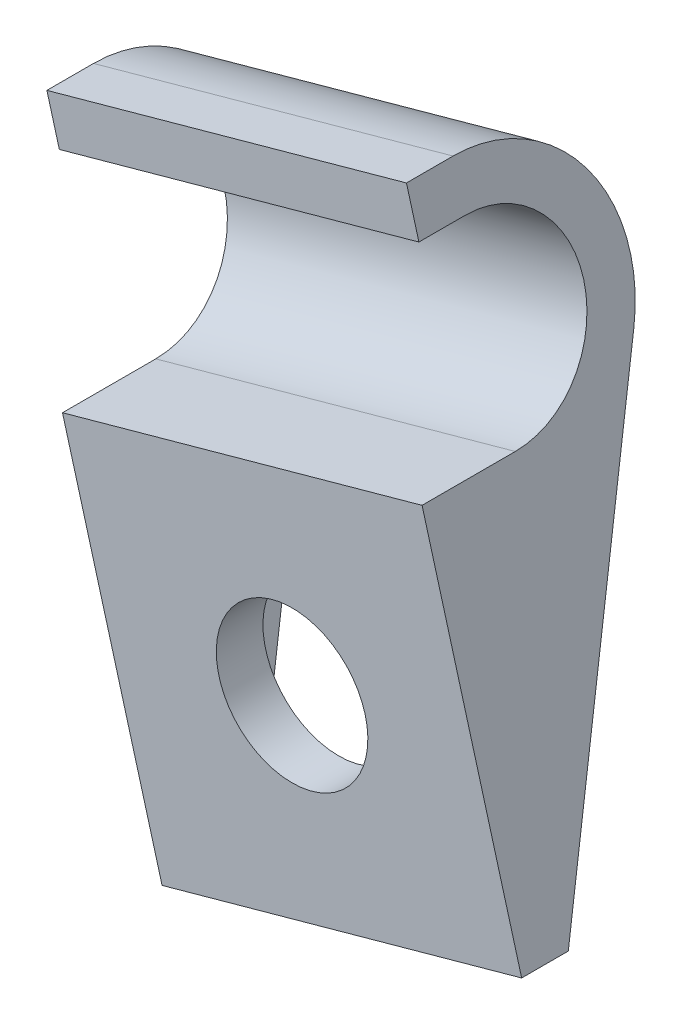
ISO-10303-21;
HEADER;
FILE_DESCRIPTION(('STEP AP214'),'2;1');
FILE_NAME('part.step','',(''),(''),'','','');
FILE_SCHEMA(('AUTOMOTIVE_DESIGN { 1 0 10303 214 1 1 1 1 }'));
ENDSEC;
DATA;
#1=APPLICATION_CONTEXT('core data for automotive mechanical design processes');
#2=APPLICATION_PROTOCOL_DEFINITION('international standard','automotive_design',2000,#1);
#3=PRODUCT_CONTEXT('',#1,'mechanical');
#4=PRODUCT('Part','Part','',(#3));
#5=PRODUCT_RELATED_PRODUCT_CATEGORY('part','',(#4));
#6=PRODUCT_DEFINITION_FORMATION('','',#4);
#7=PRODUCT_DEFINITION_CONTEXT('part definition',#1,'design');
#8=PRODUCT_DEFINITION('design','',#6,#7);
#9=PRODUCT_DEFINITION_SHAPE('','',#8);
#10=(LENGTH_UNIT() NAMED_UNIT(*) SI_UNIT(.MILLI.,.METRE.));
#11=(NAMED_UNIT(*) PLANE_ANGLE_UNIT() SI_UNIT($,.RADIAN.));
#12=(NAMED_UNIT(*) SI_UNIT($,.STERADIAN.) SOLID_ANGLE_UNIT());
#13=UNCERTAINTY_MEASURE_WITH_UNIT(LENGTH_MEASURE(1.E-05),#10,'distance_accuracy_value','');
#14=(GEOMETRIC_REPRESENTATION_CONTEXT(3) GLOBAL_UNCERTAINTY_ASSIGNED_CONTEXT((#13)) GLOBAL_UNIT_ASSIGNED_CONTEXT((#10,
#11,#12)) REPRESENTATION_CONTEXT('',''));
#15=CARTESIAN_POINT('',(0.,0.,0.));
#16=DIRECTION('',(0.,0.,1.));
#17=DIRECTION('',(1.,0.,0.));
#18=AXIS2_PLACEMENT_3D('',#15,#16,#17);
#19=CARTESIAN_POINT('',(-24.7602478042062,84.1749564014032,323.969905252873));
#20=DIRECTION('',(0.963711748830365,0.266945060202131,-1.14148934961103E-13));
#21=DIRECTION('',(0.,-4.27612089448927E-13,-1.));
#22=AXIS2_PLACEMENT_3D('',#19,#20,#21);
#23=PLANE('',#22);
#24=DIRECTION('',(-0.245580549639586,0.886582657842167,-0.391996663827944));
#25=VECTOR('',#24,1.);
#26=CARTESIAN_POINT('',(-21.7938208227092,73.4657095925258,330.319905252873));
#27=LINE('',#26,#25);
#28=CARTESIAN_POINT('',(-21.7938208227092,73.4657095925258,330.319905252873));
#29=VERTEX_POINT('',#28);
#30=CARTESIAN_POINT('',(-25.5332181618892,86.9654954532691,324.351064138066));
#31=VERTEX_POINT('',#30);
#32=EDGE_CURVE('E291',#29,#31,#27,.T.);
#33=ORIENTED_EDGE('',*,*,#32,.T.);
#34=CARTESIAN_POINT('',(-26.0315736534183,88.7646336052078,328.732405252873));
#35=DIRECTION('',(0.963711748830365,0.266945060202131,-1.14148934961103E-13));
#36=DIRECTION('',(0.266945060202131,-0.963711748830365,0.));
#37=AXIS2_PLACEMENT_3D('',#34,#35,#36);
#38=CIRCLE('',#37,4.7625);
#39=CARTESIAN_POINT('',(-24.7602478042056,84.1749564014032,328.732405252873));
#40=VERTEX_POINT('',#39);
#41=EDGE_CURVE('E106',#40,#31,#38,.T.);
#42=ORIENTED_EDGE('',*,*,#41,.F.);
#43=DIRECTION('',(1.1872860521452E-13,0.,1.));
#44=VECTOR('',#43,1.);
#45=CARTESIAN_POINT('',(-24.7602478042062,84.1749564014032,323.969905252873));
#46=LINE('',#45,#44);
#47=CARTESIAN_POINT('',(-24.7602478042054,84.1749564014032,330.319905252873));
#48=VERTEX_POINT('',#47);
#49=EDGE_CURVE('E11',#40,#48,#46,.T.);
#50=ORIENTED_EDGE('',*,*,#49,.T.);
#51=DIRECTION('',(-0.266945060202131,0.963711748830365,0.));
#52=VECTOR('',#51,1.);
#53=CARTESIAN_POINT('',(-24.7602478042054,84.1749564014032,330.319905252873));
#54=LINE('',#53,#52);
#55=EDGE_CURVE('E173',#29,#48,#54,.T.);
#56=ORIENTED_EDGE('',*,*,#55,.F.);
#57=EDGE_LOOP('',(#33,#42,#50,#56));
#58=FACE_BOUND('',#57,.T.);
#59=ADVANCED_FACE('F16',(#58),#23,.T.);
#60=CARTESIAN_POINT('',(-15.5808933965969,86.7176080998286,323.969905252872));
#61=DIRECTION('',(-0.963711748830365,-0.266945060202131,1.14148934961103E-13));
#62=DIRECTION('',(-0.266945060202131,0.963711748830365,0.));
#63=AXIS2_PLACEMENT_3D('',#60,#61,#62);
#64=PLANE('',#63);
#65=DIRECTION('',(0.245580549639586,-0.886582657842167,0.391996663827944));
#66=VECTOR('',#65,1.);
#67=CARTESIAN_POINT('',(-12.6144664151,76.0083612909511,330.319905252872));
#68=LINE('',#67,#66);
#69=CARTESIAN_POINT('',(-16.3538637542799,89.5081471516944,324.351064138065));
#70=VERTEX_POINT('',#69);
#71=CARTESIAN_POINT('',(-12.6144664151,76.0083612909511,330.319905252872));
#72=VERTEX_POINT('',#71);
#73=EDGE_CURVE('E182',#70,#72,#68,.T.);
#74=ORIENTED_EDGE('',*,*,#73,.T.);
#75=DIRECTION('',(0.266945060202131,-0.963711748830365,0.));
#76=VECTOR('',#75,1.);
#77=CARTESIAN_POINT('',(-15.5808933965962,86.7176080998285,330.319905252872));
#78=LINE('',#77,#76);
#79=CARTESIAN_POINT('',(-15.5808933965962,86.7176080998285,330.319905252872));
#80=VERTEX_POINT('',#79);
#81=EDGE_CURVE('E186',#80,#72,#78,.T.);
#82=ORIENTED_EDGE('',*,*,#81,.F.);
#83=DIRECTION('',(1.1872860521452E-13,0.,1.));
#84=VECTOR('',#83,1.);
#85=CARTESIAN_POINT('',(-15.5808933965969,86.7176080998286,323.969905252872));
#86=LINE('',#85,#84);
#87=CARTESIAN_POINT('',(-15.5808933965964,86.7176080998285,328.732405252872));
#88=VERTEX_POINT('',#87);
#89=EDGE_CURVE('E27',#88,#80,#86,.T.);
#90=ORIENTED_EDGE('',*,*,#89,.F.);
#91=CARTESIAN_POINT('',(-16.852219245809,91.3072853036331,328.732405252872));
#92=DIRECTION('',(0.963711748830365,0.266945060202131,-1.14148934961103E-13));
#93=DIRECTION('',(-0.266945060202131,0.963711748830365,0.));
#94=AXIS2_PLACEMENT_3D('',#91,#92,#93);
#95=CIRCLE('',#94,4.7625);
#96=EDGE_CURVE('E247',#88,#70,#95,.T.);
#97=ORIENTED_EDGE('',*,*,#96,.T.);
#98=EDGE_LOOP('',(#74,#82,#90,#97));
#99=FACE_BOUND('',#98,.T.);
#100=ADVANCED_FACE('F354',(#99),#64,.T.);
#101=CARTESIAN_POINT('',(-24.7602478042062,84.1749564014032,323.969905252873));
#102=DIRECTION('',(0.266945060202131,-0.963711748830365,0.));
#103=DIRECTION('',(0.,0.,-1.));
#104=AXIS2_PLACEMENT_3D('',#101,#102,#103);
#105=PLANE('',#104);
#106=DIRECTION('',(-0.963711748830365,-0.266945060202131,1.14148934961103E-13));
#107=VECTOR('',#106,1.);
#108=CARTESIAN_POINT('',(-10.5197327643549,88.1195333449094,328.732405252871));
#109=LINE('',#108,#107);
#110=EDGE_CURVE('E285',#88,#40,#109,.T.);
#111=ORIENTED_EDGE('',*,*,#110,.F.);
#112=ORIENTED_EDGE('',*,*,#89,.T.);
#113=DIRECTION('',(0.963711748830365,0.266945060202131,-1.14148934961103E-13));
#114=VECTOR('',#113,1.);
#115=CARTESIAN_POINT('',(-24.7602478042054,84.1749564014032,330.319905252873));
#116=LINE('',#115,#114);
#117=EDGE_CURVE('E178',#48,#80,#116,.T.);
#118=ORIENTED_EDGE('',*,*,#117,.F.);
#119=ORIENTED_EDGE('',*,*,#49,.F.);
#120=EDGE_LOOP('',(#111,#112,#118,#119));
#121=FACE_BOUND('',#120,.T.);
#122=ADVANCED_FACE('F184',(#121),#105,.T.);
#123=CARTESIAN_POINT('',(-27.5614660546865,88.340858322137,328.732405252873));
#124=DIRECTION('',(0.963711748830365,0.266945060202131,-1.14148934961103E-13));
#125=DIRECTION('',(0.,-4.27612089448927E-13,-1.));
#126=AXIS2_PLACEMENT_3D('',#123,#124,#125);
#127=PLANE('',#126);
#128=CARTESIAN_POINT('',(-27.5614660546865,88.340858322137,328.732405252873));
#129=DIRECTION('',(-0.963711748830365,-0.266945060202131,1.14148934961103E-13));
#130=DIRECTION('',(0.266945060202131,-0.963711748830365,0.));
#131=AXIS2_PLACEMENT_3D('',#128,#129,#130);
#132=CIRCLE('',#131,3.175);
#133=CARTESIAN_POINT('',(-28.4090166208282,91.4006431246734,328.732405252874));
#134=VERTEX_POINT('',#133);
#135=CARTESIAN_POINT('',(-26.7139154885447,85.2810735196005,328.732405252873));
#136=VERTEX_POINT('',#135);
#137=EDGE_CURVE('E204',#134,#136,#132,.T.);
#138=ORIENTED_EDGE('',*,*,#137,.F.);
#139=DIRECTION('',(-1.1872860521452E-13,0.,-1.));
#140=VECTOR('',#139,1.);
#141=CARTESIAN_POINT('',(-28.4090166208282,91.4006431246734,328.732405252874));
#142=LINE('',#141,#140);
#143=CARTESIAN_POINT('',(-28.409016620828,91.4006431246734,330.319905252874));
#144=VERTEX_POINT('',#143);
#145=EDGE_CURVE('E223',#144,#134,#142,.T.);
#146=ORIENTED_EDGE('',*,*,#145,.F.);
#147=DIRECTION('',(0.266945060202131,-0.963711748830365,0.));
#148=VECTOR('',#147,1.);
#149=CARTESIAN_POINT('',(-28.409016620828,91.4006431246734,330.319905252874));
#150=LINE('',#149,#148);
#151=CARTESIAN_POINT('',(-28.8327919038989,92.9305355259416,330.319905252874));
#152=VERTEX_POINT('',#151);
#153=EDGE_CURVE('E243',#152,#144,#150,.T.);
#154=ORIENTED_EDGE('',*,*,#153,.F.);
#155=DIRECTION('',(1.1872860521452E-13,0.,1.));
#156=VECTOR('',#155,1.);
#157=CARTESIAN_POINT('',(-28.8327919038989,92.9305355259416,330.319905252874));
#158=LINE('',#157,#156);
#159=CARTESIAN_POINT('',(-28.8327919038991,92.9305355259416,328.732405252874));
#160=VERTEX_POINT('',#159);
#161=EDGE_CURVE('E248',#160,#152,#158,.T.);
#162=ORIENTED_EDGE('',*,*,#161,.F.);
#163=CARTESIAN_POINT('',(-27.5614660546865,88.340858322137,328.732405252873));
#164=DIRECTION('',(0.963711748830365,0.266945060202131,-1.14148934961103E-13));
#165=DIRECTION('',(-0.266945060202131,0.963711748830365,0.));
#166=AXIS2_PLACEMENT_3D('',#163,#164,#165);
#167=CIRCLE('',#166,4.7625);
#168=CARTESIAN_POINT('',(-27.0631105631574,86.5417201701982,324.351064138066));
#169=VERTEX_POINT('',#168);
#170=EDGE_CURVE('E117',#169,#160,#167,.T.);
#171=ORIENTED_EDGE('',*,*,#170,.F.);
#172=DIRECTION('',(-0.245580549639586,0.886582657842167,-0.391996663827944));
#173=VECTOR('',#172,1.);
#174=CARTESIAN_POINT('',(-23.3237132239774,73.0419343094549,330.319905252873));
#175=LINE('',#174,#173);
#176=CARTESIAN_POINT('',(-23.3237132239774,73.0419343094549,330.319905252873));
#177=VERTEX_POINT('',#176);
#178=EDGE_CURVE('E197',#177,#169,#175,.T.);
#179=ORIENTED_EDGE('',*,*,#178,.F.);
#180=DIRECTION('',(-1.1872860521452E-13,0.,-1.));
#181=VECTOR('',#180,1.);
#182=CARTESIAN_POINT('',(-23.3237132239773,73.0419343094549,331.907405252873));
#183=LINE('',#182,#181);
#184=CARTESIAN_POINT('',(-23.3237132239773,73.0419343094549,331.907405252873));
#185=VERTEX_POINT('',#184);
#186=EDGE_CURVE('E150',#185,#177,#183,.T.);
#187=ORIENTED_EDGE('',*,*,#186,.F.);
#188=DIRECTION('',(0.266945060202131,-0.963711748830365,0.));
#189=VECTOR('',#188,1.);
#190=CARTESIAN_POINT('',(-26.7139154885443,85.2810735196005,331.907405252873));
#191=LINE('',#190,#189);
#192=CARTESIAN_POINT('',(-26.7139154885443,85.2810735196005,331.907405252873));
#193=VERTEX_POINT('',#192);
#194=EDGE_CURVE('E215',#193,#185,#191,.T.);
#195=ORIENTED_EDGE('',*,*,#194,.F.);
#196=DIRECTION('',(1.18801530547233E-13,0.,1.));
#197=VECTOR('',#196,1.);
#198=CARTESIAN_POINT('',(-26.7139154885447,85.2810735196005,328.732405252873));
#199=LINE('',#198,#197);
#200=EDGE_CURVE('E164',#136,#193,#199,.T.);
#201=ORIENTED_EDGE('',*,*,#200,.F.);
#202=EDGE_LOOP('',(#138,#146,#154,#162,#171,#179,#187,#195,#201));
#203=FACE_BOUND('',#202,.T.);
#204=ADVANCED_FACE('F361',(#203),#127,.F.);
#205=CARTESIAN_POINT('',(-15.3223268445408,91.731060586704,328.732405252872));
#206=DIRECTION('',(0.963711748830365,0.266945060202131,-1.14148934961103E-13));
#207=DIRECTION('',(0.,-4.27612089448927E-13,-1.));
#208=AXIS2_PLACEMENT_3D('',#205,#206,#207);
#209=PLANE('',#208);
#210=CARTESIAN_POINT('',(-15.3223268445408,91.731060586704,328.732405252872));
#211=DIRECTION('',(-0.963711748830365,-0.266945060202131,1.14148934961103E-13));
#212=DIRECTION('',(0.266945060202131,-0.963711748830365,0.));
#213=AXIS2_PLACEMENT_3D('',#210,#211,#212);
#214=CIRCLE('',#213,3.175);
#215=CARTESIAN_POINT('',(-16.1698774106826,94.7908453892404,328.732405252872));
#216=VERTEX_POINT('',#215);
#217=CARTESIAN_POINT('',(-14.4747762783991,88.6712757841676,328.732405252872));
#218=VERTEX_POINT('',#217);
#219=EDGE_CURVE('E203',#216,#218,#214,.T.);
#220=ORIENTED_EDGE('',*,*,#219,.T.);
#221=DIRECTION('',(1.18801530547233E-13,0.,1.));
#222=VECTOR('',#221,1.);
#223=CARTESIAN_POINT('',(-14.4747762783991,88.6712757841676,328.732405252872));
#224=LINE('',#223,#222);
#225=CARTESIAN_POINT('',(-14.4747762783987,88.6712757841676,331.907405252872));
#226=VERTEX_POINT('',#225);
#227=EDGE_CURVE('E218',#218,#226,#224,.T.);
#228=ORIENTED_EDGE('',*,*,#227,.T.);
#229=DIRECTION('',(0.266945060202131,-0.963711748830365,0.));
#230=VECTOR('',#229,1.);
#231=CARTESIAN_POINT('',(-14.4747762783987,88.6712757841676,331.907405252872));
#232=LINE('',#231,#230);
#233=CARTESIAN_POINT('',(-11.0845740138316,76.432136574022,331.907405252872));
#234=VERTEX_POINT('',#233);
#235=EDGE_CURVE('E194',#226,#234,#232,.T.);
#236=ORIENTED_EDGE('',*,*,#235,.T.);
#237=DIRECTION('',(-1.1872860521452E-13,0.,-1.));
#238=VECTOR('',#237,1.);
#239=CARTESIAN_POINT('',(-11.0845740138316,76.432136574022,331.907405252872));
#240=LINE('',#239,#238);
#241=CARTESIAN_POINT('',(-11.0845740138318,76.432136574022,330.319905252871));
#242=VERTEX_POINT('',#241);
#243=EDGE_CURVE('E222',#234,#242,#240,.T.);
#244=ORIENTED_EDGE('',*,*,#243,.T.);
#245=DIRECTION('',(-0.245580549639586,0.886582657842167,-0.391996663827944));
#246=VECTOR('',#245,1.);
#247=CARTESIAN_POINT('',(-11.0845740138318,76.432136574022,330.319905252871));
#248=LINE('',#247,#246);
#249=CARTESIAN_POINT('',(-14.8239713530117,89.9319224347653,324.351064138065));
#250=VERTEX_POINT('',#249);
#251=EDGE_CURVE('E290',#242,#250,#248,.T.);
#252=ORIENTED_EDGE('',*,*,#251,.T.);
#253=CARTESIAN_POINT('',(-15.3223268445408,91.731060586704,328.732405252872));
#254=DIRECTION('',(0.963711748830365,0.266945060202131,-1.14148934961103E-13));
#255=DIRECTION('',(-0.266945060202131,0.963711748830365,0.));
#256=AXIS2_PLACEMENT_3D('',#253,#254,#255);
#257=CIRCLE('',#256,4.7625);
#258=CARTESIAN_POINT('',(-16.5936526937535,96.3207377905086,328.732405252872));
#259=VERTEX_POINT('',#258);
#260=EDGE_CURVE('E20',#250,#259,#257,.T.);
#261=ORIENTED_EDGE('',*,*,#260,.T.);
#262=DIRECTION('',(1.1872860521452E-13,0.,1.));
#263=VECTOR('',#262,1.);
#264=CARTESIAN_POINT('',(-16.5936526937533,96.3207377905086,330.319905252872));
#265=LINE('',#264,#263);
#266=CARTESIAN_POINT('',(-16.5936526937533,96.3207377905086,330.319905252872));
#267=VERTEX_POINT('',#266);
#268=EDGE_CURVE('E312',#259,#267,#265,.T.);
#269=ORIENTED_EDGE('',*,*,#268,.T.);
#270=DIRECTION('',(0.266945060202131,-0.963711748830365,0.));
#271=VECTOR('',#270,1.);
#272=CARTESIAN_POINT('',(-16.1698774106824,94.7908453892404,330.319905252872));
#273=LINE('',#272,#271);
#274=CARTESIAN_POINT('',(-16.1698774106824,94.7908453892404,330.319905252872));
#275=VERTEX_POINT('',#274);
#276=EDGE_CURVE('E226',#267,#275,#273,.T.);
#277=ORIENTED_EDGE('',*,*,#276,.T.);
#278=DIRECTION('',(-1.1872860521452E-13,0.,-1.));
#279=VECTOR('',#278,1.);
#280=CARTESIAN_POINT('',(-16.1698774106826,94.7908453892404,328.732405252872));
#281=LINE('',#280,#279);
#282=EDGE_CURVE('E40',#275,#216,#281,.T.);
#283=ORIENTED_EDGE('',*,*,#282,.T.);
#284=EDGE_LOOP('',(#220,#228,#236,#244,#252,#261,#269,#277,#283));
#285=FACE_BOUND('',#284,.T.);
#286=ADVANCED_FACE('F266',(#285),#209,.T.);
#287=CARTESIAN_POINT('',(-16.1698774106826,94.7908453892404,328.732405252872));
#288=DIRECTION('',(-0.266945060202131,0.963711748830365,0.));
#289=DIRECTION('',(1.22396526221039E-13,0.,1.));
#290=AXIS2_PLACEMENT_3D('',#287,#288,#289);
#291=PLANE('',#290);
#292=ORIENTED_EDGE('',*,*,#145,.T.);
#293=DIRECTION('',(-0.963711748830365,-0.266945060202131,1.14148934961103E-13));
#294=VECTOR('',#293,1.);
#295=CARTESIAN_POINT('',(-16.1698774106826,94.7908453892404,328.732405252872));
#296=LINE('',#295,#294);
#297=EDGE_CURVE('E219',#216,#134,#296,.T.);
#298=ORIENTED_EDGE('',*,*,#297,.F.);
#299=ORIENTED_EDGE('',*,*,#282,.F.);
#300=DIRECTION('',(-0.963711748830365,-0.266945060202131,1.14148934961103E-13));
#301=VECTOR('',#300,1.);
#302=CARTESIAN_POINT('',(-16.1698774106824,94.7908453892404,330.319905252872));
#303=LINE('',#302,#301);
#304=EDGE_CURVE('E233',#275,#144,#303,.T.);
#305=ORIENTED_EDGE('',*,*,#304,.T.);
#306=EDGE_LOOP('',(#292,#298,#299,#305));
#307=FACE_BOUND('',#306,.T.);
#308=ADVANCED_FACE('F369',(#307),#291,.F.);
#309=CARTESIAN_POINT('',(-16.1698774106824,94.7908453892404,330.319905252872));
#310=DIRECTION('',(-1.18765067880877E-13,0.,-1.));
#311=DIRECTION('',(-1.,0.,1.18765067880877E-13));
#312=AXIS2_PLACEMENT_3D('',#309,#310,#311);
#313=PLANE('',#312);
#314=ORIENTED_EDGE('',*,*,#153,.T.);
#315=ORIENTED_EDGE('',*,*,#304,.F.);
#316=ORIENTED_EDGE('',*,*,#276,.F.);
#317=DIRECTION('',(-0.963711748830365,-0.266945060202131,1.14148934961103E-13));
#318=VECTOR('',#317,1.);
#319=CARTESIAN_POINT('',(-16.5936526937533,96.3207377905086,330.319905252872));
#320=LINE('',#319,#318);
#321=EDGE_CURVE('E251',#267,#152,#320,.T.);
#322=ORIENTED_EDGE('',*,*,#321,.T.);
#323=EDGE_LOOP('',(#314,#315,#316,#322));
#324=FACE_BOUND('',#323,.T.);
#325=ADVANCED_FACE('F387',(#324),#313,.F.);
#326=CARTESIAN_POINT('',(-16.5936526937533,96.3207377905086,330.319905252872));
#327=DIRECTION('',(0.266945060202131,-0.963711748830365,0.));
#328=DIRECTION('',(0.,0.,-1.));
#329=AXIS2_PLACEMENT_3D('',#326,#327,#328);
#330=PLANE('',#329);
#331=ORIENTED_EDGE('',*,*,#161,.T.);
#332=ORIENTED_EDGE('',*,*,#321,.F.);
#333=ORIENTED_EDGE('',*,*,#268,.F.);
#334=DIRECTION('',(-0.963711748830365,-0.266945060202131,1.14148934961103E-13));
#335=VECTOR('',#334,1.);
#336=CARTESIAN_POINT('',(-16.5936526937535,96.3207377905086,328.732405252872));
#337=LINE('',#336,#335);
#338=EDGE_CURVE('E221',#259,#160,#337,.T.);
#339=ORIENTED_EDGE('',*,*,#338,.T.);
#340=EDGE_LOOP('',(#331,#332,#333,#339));
#341=FACE_BOUND('',#340,.T.);
#342=ADVANCED_FACE('F336',(#341),#330,.F.);
#343=CARTESIAN_POINT('',(-15.3223268445408,91.731060586704,328.732405252872));
#344=DIRECTION('',(-0.963711748830365,-0.266945060202131,1.14148934961103E-13));
#345=DIRECTION('',(-0.266945060202131,0.963711748830365,0.));
#346=AXIS2_PLACEMENT_3D('',#343,#344,#345);
#347=CYLINDRICAL_SURFACE('',#346,4.7625);
#348=ORIENTED_EDGE('',*,*,#170,.T.);
#349=ORIENTED_EDGE('',*,*,#338,.F.);
#350=ORIENTED_EDGE('',*,*,#260,.F.);
#351=DIRECTION('',(-0.963711748830365,-0.266945060202131,1.14148934961103E-13));
#352=VECTOR('',#351,1.);
#353=CARTESIAN_POINT('',(-14.8239713530117,89.9319224347653,324.351064138065));
#354=LINE('',#353,#352);
#355=EDGE_CURVE('E255',#250,#70,#354,.T.);
#356=ORIENTED_EDGE('',*,*,#355,.T.);
#357=ORIENTED_EDGE('',*,*,#96,.F.);
#358=ORIENTED_EDGE('',*,*,#110,.T.);
#359=ORIENTED_EDGE('',*,*,#41,.T.);
#360=DIRECTION('',(-0.963711748830365,-0.266945060202131,1.14148934961103E-13));
#361=VECTOR('',#360,1.);
#362=CARTESIAN_POINT('',(-14.8239713530117,89.9319224347653,324.351064138065));
#363=LINE('',#362,#361);
#364=EDGE_CURVE('E295',#31,#169,#363,.T.);
#365=ORIENTED_EDGE('',*,*,#364,.T.);
#366=EDGE_LOOP('',(#348,#349,#350,#356,#357,#358,#359,#365));
#367=FACE_BOUND('',#366,.T.);
#368=ADVANCED_FACE('F334',(#367),#347,.T.);
#369=CARTESIAN_POINT('',(-11.0845740138316,76.432136574022,331.907405252872));
#370=DIRECTION('',(-0.266945060202131,0.963711748830365,0.));
#371=DIRECTION('',(1.22396526221039E-13,0.,1.));
#372=AXIS2_PLACEMENT_3D('',#369,#370,#371);
#373=PLANE('',#372);
#374=ORIENTED_EDGE('',*,*,#186,.T.);
#375=DIRECTION('',(-0.963711748830365,-0.266945060202131,1.14148934961103E-13));
#376=VECTOR('',#375,1.);
#377=CARTESIAN_POINT('',(-11.0845740138318,76.432136574022,330.319905252871));
#378=LINE('',#377,#376);
#379=EDGE_CURVE('E294',#29,#177,#378,.T.);
#380=ORIENTED_EDGE('',*,*,#379,.F.);
#381=DIRECTION('',(-0.963711748830365,-0.266945060202131,1.14148934961103E-13));
#382=VECTOR('',#381,1.);
#383=CARTESIAN_POINT('',(-21.7938208227092,73.4657095925258,330.319905252873));
#384=LINE('',#383,#382);
#385=EDGE_CURVE('E180',#72,#29,#384,.T.);
#386=ORIENTED_EDGE('',*,*,#385,.F.);
#387=DIRECTION('',(-0.963711748830365,-0.266945060202131,1.14148934961103E-13));
#388=VECTOR('',#387,1.);
#389=CARTESIAN_POINT('',(-11.0845740138318,76.432136574022,330.319905252871));
#390=LINE('',#389,#388);
#391=EDGE_CURVE('E275',#242,#72,#390,.T.);
#392=ORIENTED_EDGE('',*,*,#391,.F.);
#393=ORIENTED_EDGE('',*,*,#243,.F.);
#394=DIRECTION('',(-0.963711748830365,-0.266945060202131,1.14148934961103E-13));
#395=VECTOR('',#394,1.);
#396=CARTESIAN_POINT('',(-11.0845740138316,76.432136574022,331.907405252872));
#397=LINE('',#396,#395);
#398=EDGE_CURVE('E259',#234,#185,#397,.T.);
#399=ORIENTED_EDGE('',*,*,#398,.T.);
#400=EDGE_LOOP('',(#374,#380,#386,#392,#393,#399));
#401=FACE_BOUND('',#400,.T.);
#402=ADVANCED_FACE('F273',(#401),#373,.F.);
#403=CARTESIAN_POINT('',(-14.4747762783991,88.6712757841676,328.732405252872));
#404=DIRECTION('',(0.266945060202131,-0.963711748830365,0.));
#405=DIRECTION('',(0.,0.,-1.));
#406=AXIS2_PLACEMENT_3D('',#403,#404,#405);
#407=PLANE('',#406);
#408=ORIENTED_EDGE('',*,*,#200,.T.);
#409=DIRECTION('',(-0.963711748830365,-0.266945060202131,1.14148934961103E-13));
#410=VECTOR('',#409,1.);
#411=CARTESIAN_POINT('',(-14.4747762783987,88.6712757841676,331.907405252872));
#412=LINE('',#411,#410);
#413=EDGE_CURVE('E187',#226,#193,#412,.T.);
#414=ORIENTED_EDGE('',*,*,#413,.F.);
#415=ORIENTED_EDGE('',*,*,#227,.F.);
#416=DIRECTION('',(-0.963711748830365,-0.266945060202131,1.14148934961103E-13));
#417=VECTOR('',#416,1.);
#418=CARTESIAN_POINT('',(-14.4747762783991,88.6712757841676,328.732405252872));
#419=LINE('',#418,#417);
#420=EDGE_CURVE('E200',#218,#136,#419,.T.);
#421=ORIENTED_EDGE('',*,*,#420,.T.);
#422=EDGE_LOOP('',(#408,#414,#415,#421));
#423=FACE_BOUND('',#422,.T.);
#424=ADVANCED_FACE('F385',(#423),#407,.F.);
#425=CARTESIAN_POINT('',(-15.3223268445408,91.731060586704,328.732405252872));
#426=DIRECTION('',(-0.963711748830365,-0.266945060202131,1.14148934961103E-13));
#427=DIRECTION('',(-0.266945060202131,0.963711748830365,0.));
#428=AXIS2_PLACEMENT_3D('',#425,#426,#427);
#429=CYLINDRICAL_SURFACE('',#428,3.175);
#430=ORIENTED_EDGE('',*,*,#137,.T.);
#431=ORIENTED_EDGE('',*,*,#420,.F.);
#432=ORIENTED_EDGE('',*,*,#219,.F.);
#433=ORIENTED_EDGE('',*,*,#297,.T.);
#434=EDGE_LOOP('',(#430,#431,#432,#433));
#435=FACE_BOUND('',#434,.T.);
#436=ADVANCED_FACE('F382',(#435),#429,.F.);
#437=CARTESIAN_POINT('',(-11.0845740138318,76.432136574022,330.319905252871));
#438=DIRECTION('',(-0.104641573024484,0.377771790433325,0.919966638279759));
#439=DIRECTION('',(0.963711748830437,0.266945060201873,0.));
#440=AXIS2_PLACEMENT_3D('',#437,#438,#439);
#441=PLANE('',#440);
#442=ORIENTED_EDGE('',*,*,#364,.F.);
#443=ORIENTED_EDGE('',*,*,#32,.F.);
#444=ORIENTED_EDGE('',*,*,#379,.T.);
#445=ORIENTED_EDGE('',*,*,#178,.T.);
#446=EDGE_LOOP('',(#442,#443,#444,#445));
#447=FACE_BOUND('',#446,.T.);
#448=ADVANCED_FACE('F358',(#447),#441,.F.);
#449=CARTESIAN_POINT('',(-11.0845740138318,76.432136574022,330.319905252871));
#450=DIRECTION('',(-0.104641573024484,0.377771790433325,0.919966638279759));
#451=DIRECTION('',(0.963711748830437,0.266945060201873,0.));
#452=AXIS2_PLACEMENT_3D('',#449,#450,#451);
#453=PLANE('',#452);
#454=ORIENTED_EDGE('',*,*,#73,.F.);
#455=ORIENTED_EDGE('',*,*,#355,.F.);
#456=ORIENTED_EDGE('',*,*,#251,.F.);
#457=ORIENTED_EDGE('',*,*,#391,.T.);
#458=EDGE_LOOP('',(#454,#455,#456,#457));
#459=FACE_BOUND('',#458,.T.);
#460=ADVANCED_FACE('F353',(#459),#453,.F.);
#461=CARTESIAN_POINT('',(-15.5808933965962,86.7176080998285,330.319905252872));
#462=DIRECTION('',(-1.1872860521452E-13,0.,-1.));
#463=DIRECTION('',(-1.,0.,1.1872860521452E-13));
#464=AXIS2_PLACEMENT_3D('',#461,#462,#463);
#465=PLANE('',#464);
#466=CARTESIAN_POINT('',(-18.8992447511882,80.8566050468113,330.319905252872));
#467=DIRECTION('',(1.1872860521452E-13,0.,1.));
#468=DIRECTION('',(0.963711748830364,0.266945060202135,-1.14148934961103E-13));
#469=AXIS2_PLACEMENT_3D('',#466,#467,#468);
#470=CIRCLE('',#469,2.5796875);
#471=CARTESIAN_POINT('',(-16.4131695991273,81.5452398818015,330.319905252872));
#472=VERTEX_POINT('',#471);
#473=EDGE_CURVE('E207',#472,#472,#470,.T.);
#474=ORIENTED_EDGE('',*,*,#473,.T.);
#475=EDGE_LOOP('',(#474));
#476=FACE_BOUND('',#475,.T.);
#477=ORIENTED_EDGE('',*,*,#117,.T.);
#478=ORIENTED_EDGE('',*,*,#81,.T.);
#479=ORIENTED_EDGE('',*,*,#385,.T.);
#480=ORIENTED_EDGE('',*,*,#55,.T.);
#481=EDGE_LOOP('',(#477,#478,#479,#480));
#482=FACE_BOUND('',#481,.T.);
#483=ADVANCED_FACE('F18',(#476,#482),#465,.T.);
#484=CARTESIAN_POINT('',(-14.4747762783987,88.6712757841676,331.907405252872));
#485=DIRECTION('',(-1.18761296555873E-13,0.,-1.));
#486=DIRECTION('',(-1.,0.,1.18761296555873E-13));
#487=AXIS2_PLACEMENT_3D('',#484,#485,#486);
#488=PLANE('',#487);
#489=CARTESIAN_POINT('',(-18.899244751188,80.8566050468113,331.907405252872));
#490=DIRECTION('',(-1.1872860521452E-13,0.,-1.));
#491=DIRECTION('',(0.963711748830365,0.26694506020213,-1.14148934961103E-13));
#492=AXIS2_PLACEMENT_3D('',#489,#490,#491);
#493=CIRCLE('',#492,2.5796875);
#494=CARTESIAN_POINT('',(-16.4131695991271,81.5452398818015,331.907405252872));
#495=VERTEX_POINT('',#494);
#496=EDGE_CURVE('E212',#495,#495,#493,.T.);
#497=ORIENTED_EDGE('',*,*,#496,.T.);
#498=EDGE_LOOP('',(#497));
#499=FACE_BOUND('',#498,.T.);
#500=ORIENTED_EDGE('',*,*,#194,.T.);
#501=ORIENTED_EDGE('',*,*,#398,.F.);
#502=ORIENTED_EDGE('',*,*,#235,.F.);
#503=ORIENTED_EDGE('',*,*,#413,.T.);
#504=EDGE_LOOP('',(#500,#501,#502,#503));
#505=FACE_BOUND('',#504,.T.);
#506=ADVANCED_FACE('F271',(#499,#505),#488,.F.);
#507=CARTESIAN_POINT('',(-18.8992447511883,80.8566050468113,329.367405252872));
#508=DIRECTION('',(1.1872860521452E-13,0.,1.));
#509=DIRECTION('',(-0.963711748830365,-0.26694506020213,1.14148934961103E-13));
#510=AXIS2_PLACEMENT_3D('',#507,#508,#509);
#511=CYLINDRICAL_SURFACE('',#510,2.5796875);
#512=ORIENTED_EDGE('',*,*,#473,.F.);
#513=DIRECTION('',(1.1872860521452E-13,0.,1.));
#514=VECTOR('',#513,1.);
#515=CARTESIAN_POINT('',(-16.4131695991274,81.5452398818015,329.367405252872));
#516=LINE('',#515,#514);
#517=EDGE_CURVE('E211',#472,#495,#516,.T.);
#518=ORIENTED_EDGE('',*,*,#517,.T.);
#519=ORIENTED_EDGE('',*,*,#496,.F.);
#520=ORIENTED_EDGE('',*,*,#517,.F.);
#521=EDGE_LOOP('',(#512,#518,#519,#520));
#522=FACE_BOUND('',#521,.T.);
#523=ADVANCED_FACE('F394',(#522),#511,.F.);
#524=CLOSED_SHELL('',(#59,#100,#122,#204,#286,#308,#325,#342,#368,#402,#424,#436,#448,#460,#483,
#506,#523));
#525=MANIFOLD_SOLID_BREP('B1',#524);
#526=ADVANCED_BREP_SHAPE_REPRESENTATION('',(#18,#525),#14);
#527=SHAPE_DEFINITION_REPRESENTATION(#9,#526);
ENDSEC;
END-ISO-10303-21;
